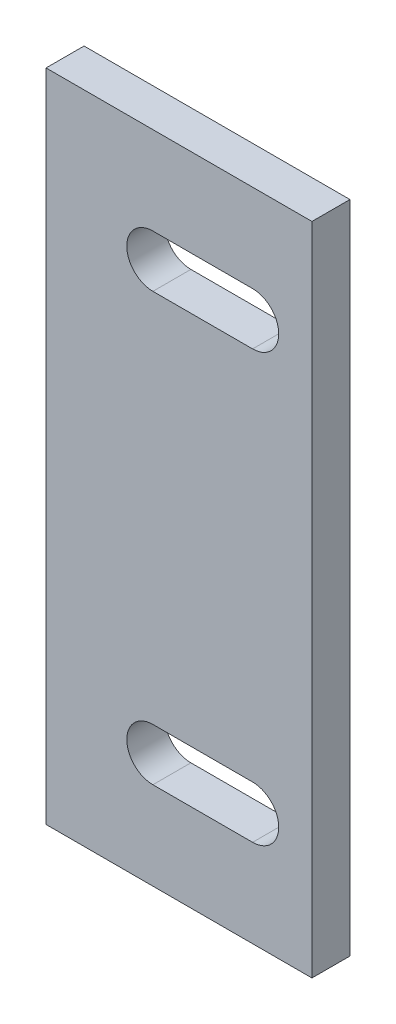
ISO-10303-21;
HEADER;
FILE_DESCRIPTION(('STEP AP214'),'2;1');
FILE_NAME('part.step','',(''),(''),'','','');
FILE_SCHEMA(('AUTOMOTIVE_DESIGN { 1 0 10303 214 1 1 1 1 }'));
ENDSEC;
DATA;
#1=APPLICATION_CONTEXT('core data for automotive mechanical design processes');
#2=APPLICATION_PROTOCOL_DEFINITION('international standard','automotive_design',2000,#1);
#3=PRODUCT_CONTEXT('',#1,'mechanical');
#4=PRODUCT('Part','Part','',(#3));
#5=PRODUCT_RELATED_PRODUCT_CATEGORY('part','',(#4));
#6=PRODUCT_DEFINITION_FORMATION('','',#4);
#7=PRODUCT_DEFINITION_CONTEXT('part definition',#1,'design');
#8=PRODUCT_DEFINITION('design','',#6,#7);
#9=PRODUCT_DEFINITION_SHAPE('','',#8);
#10=(LENGTH_UNIT() NAMED_UNIT(*) SI_UNIT(.MILLI.,.METRE.));
#11=(NAMED_UNIT(*) PLANE_ANGLE_UNIT() SI_UNIT($,.RADIAN.));
#12=(NAMED_UNIT(*) SI_UNIT($,.STERADIAN.) SOLID_ANGLE_UNIT());
#13=UNCERTAINTY_MEASURE_WITH_UNIT(LENGTH_MEASURE(1.E-05),#10,'distance_accuracy_value','');
#14=(GEOMETRIC_REPRESENTATION_CONTEXT(3) GLOBAL_UNCERTAINTY_ASSIGNED_CONTEXT((#13)) GLOBAL_UNIT_ASSIGNED_CONTEXT((#10,
#11,#12)) REPRESENTATION_CONTEXT('',''));
#15=CARTESIAN_POINT('',(0.,0.,0.));
#16=DIRECTION('',(0.,0.,1.));
#17=DIRECTION('',(1.,0.,0.));
#18=AXIS2_PLACEMENT_3D('',#15,#16,#17);
#19=CARTESIAN_POINT('',(0.,34.5,0.));
#20=DIRECTION('',(-1.,0.,0.));
#21=DIRECTION('',(0.,0.,1.));
#22=AXIS2_PLACEMENT_3D('',#19,#20,#21);
#23=PLANE('',#22);
#24=DIRECTION('',(0.,-1.,0.));
#25=VECTOR('',#24,1.);
#26=CARTESIAN_POINT('',(0.,34.5,4.));
#27=LINE('',#26,#25);
#28=CARTESIAN_POINT('',(0.,34.5,4.));
#29=VERTEX_POINT('',#28);
#30=CARTESIAN_POINT('',(0.,-34.5,4.));
#31=VERTEX_POINT('',#30);
#32=EDGE_CURVE('E195',#29,#31,#27,.T.);
#33=ORIENTED_EDGE('',*,*,#32,.F.);
#34=DIRECTION('',(0.,0.,1.));
#35=VECTOR('',#34,1.);
#36=CARTESIAN_POINT('',(0.,34.5,0.));
#37=LINE('',#36,#35);
#38=CARTESIAN_POINT('',(0.,34.5,0.));
#39=VERTEX_POINT('',#38);
#40=EDGE_CURVE('E11',#39,#29,#37,.T.);
#41=ORIENTED_EDGE('',*,*,#40,.F.);
#42=DIRECTION('',(0.,-1.,0.));
#43=VECTOR('',#42,1.);
#44=CARTESIAN_POINT('',(0.,34.5,0.));
#45=LINE('',#44,#43);
#46=CARTESIAN_POINT('',(0.,-34.5,0.));
#47=VERTEX_POINT('',#46);
#48=EDGE_CURVE('E200',#39,#47,#45,.T.);
#49=ORIENTED_EDGE('',*,*,#48,.T.);
#50=DIRECTION('',(0.,0.,1.));
#51=VECTOR('',#50,1.);
#52=CARTESIAN_POINT('',(0.,-34.5,0.));
#53=LINE('',#52,#51);
#54=EDGE_CURVE('E42',#47,#31,#53,.T.);
#55=ORIENTED_EDGE('',*,*,#54,.T.);
#56=EDGE_LOOP('',(#33,#41,#49,#55));
#57=FACE_BOUND('',#56,.T.);
#58=ADVANCED_FACE('F41',(#57),#23,.T.);
#59=CARTESIAN_POINT('',(28.,34.5,0.));
#60=DIRECTION('',(0.,1.,0.));
#61=DIRECTION('',(0.,0.,1.));
#62=AXIS2_PLACEMENT_3D('',#59,#60,#61);
#63=PLANE('',#62);
#64=DIRECTION('',(-1.,0.,0.));
#65=VECTOR('',#64,1.);
#66=CARTESIAN_POINT('',(28.,34.5,4.));
#67=LINE('',#66,#65);
#68=CARTESIAN_POINT('',(28.,34.5,4.));
#69=VERTEX_POINT('',#68);
#70=EDGE_CURVE('E202',#69,#29,#67,.T.);
#71=ORIENTED_EDGE('',*,*,#70,.F.);
#72=DIRECTION('',(0.,0.,1.));
#73=VECTOR('',#72,1.);
#74=CARTESIAN_POINT('',(28.,34.5,0.));
#75=LINE('',#74,#73);
#76=CARTESIAN_POINT('',(28.,34.5,0.));
#77=VERTEX_POINT('',#76);
#78=EDGE_CURVE('E47',#77,#69,#75,.T.);
#79=ORIENTED_EDGE('',*,*,#78,.F.);
#80=DIRECTION('',(-1.,0.,0.));
#81=VECTOR('',#80,1.);
#82=CARTESIAN_POINT('',(28.,34.5,0.));
#83=LINE('',#82,#81);
#84=EDGE_CURVE('E209',#77,#39,#83,.T.);
#85=ORIENTED_EDGE('',*,*,#84,.T.);
#86=ORIENTED_EDGE('',*,*,#40,.T.);
#87=EDGE_LOOP('',(#71,#79,#85,#86));
#88=FACE_BOUND('',#87,.T.);
#89=ADVANCED_FACE('F232',(#88),#63,.T.);
#90=CARTESIAN_POINT('',(28.,-34.5,0.));
#91=DIRECTION('',(1.,0.,0.));
#92=DIRECTION('',(0.,0.,-1.));
#93=AXIS2_PLACEMENT_3D('',#90,#91,#92);
#94=PLANE('',#93);
#95=DIRECTION('',(0.,1.,0.));
#96=VECTOR('',#95,1.);
#97=CARTESIAN_POINT('',(28.,-34.5,4.));
#98=LINE('',#97,#96);
#99=CARTESIAN_POINT('',(28.,-34.5,4.));
#100=VERTEX_POINT('',#99);
#101=EDGE_CURVE('E219',#100,#69,#98,.T.);
#102=ORIENTED_EDGE('',*,*,#101,.F.);
#103=DIRECTION('',(0.,0.,1.));
#104=VECTOR('',#103,1.);
#105=CARTESIAN_POINT('',(28.,-34.5,0.));
#106=LINE('',#105,#104);
#107=CARTESIAN_POINT('',(28.,-34.5,0.));
#108=VERTEX_POINT('',#107);
#109=EDGE_CURVE('E225',#108,#100,#106,.T.);
#110=ORIENTED_EDGE('',*,*,#109,.F.);
#111=DIRECTION('',(0.,1.,0.));
#112=VECTOR('',#111,1.);
#113=CARTESIAN_POINT('',(28.,-34.5,0.));
#114=LINE('',#113,#112);
#115=EDGE_CURVE('E207',#108,#77,#114,.T.);
#116=ORIENTED_EDGE('',*,*,#115,.T.);
#117=ORIENTED_EDGE('',*,*,#78,.T.);
#118=EDGE_LOOP('',(#102,#110,#116,#117));
#119=FACE_BOUND('',#118,.T.);
#120=ADVANCED_FACE('F239',(#119),#94,.T.);
#121=CARTESIAN_POINT('',(0.,-34.5,0.));
#122=DIRECTION('',(0.,-1.,0.));
#123=DIRECTION('',(0.,0.,-1.));
#124=AXIS2_PLACEMENT_3D('',#121,#122,#123);
#125=PLANE('',#124);
#126=DIRECTION('',(1.,0.,0.));
#127=VECTOR('',#126,1.);
#128=CARTESIAN_POINT('',(0.,-34.5,4.));
#129=LINE('',#128,#127);
#130=EDGE_CURVE('E211',#31,#100,#129,.T.);
#131=ORIENTED_EDGE('',*,*,#130,.F.);
#132=ORIENTED_EDGE('',*,*,#54,.F.);
#133=DIRECTION('',(1.,0.,0.));
#134=VECTOR('',#133,1.);
#135=CARTESIAN_POINT('',(0.,-34.5,0.));
#136=LINE('',#135,#134);
#137=EDGE_CURVE('E205',#47,#108,#136,.T.);
#138=ORIENTED_EDGE('',*,*,#137,.T.);
#139=ORIENTED_EDGE('',*,*,#109,.T.);
#140=EDGE_LOOP('',(#131,#132,#138,#139));
#141=FACE_BOUND('',#140,.T.);
#142=ADVANCED_FACE('F229',(#141),#125,.T.);
#143=CARTESIAN_POINT('',(0.,0.,0.));
#144=DIRECTION('',(0.,0.,1.));
#145=DIRECTION('',(1.,0.,0.));
#146=AXIS2_PLACEMENT_3D('',#143,#144,#145);
#147=PLANE('',#146);
#148=DIRECTION('',(-1.,0.,0.));
#149=VECTOR('',#148,1.);
#150=CARTESIAN_POINT('',(11.25,-19.75,0.));
#151=LINE('',#150,#149);
#152=CARTESIAN_POINT('',(21.75,-19.75,0.));
#153=VERTEX_POINT('',#152);
#154=CARTESIAN_POINT('',(11.25,-19.75,0.));
#155=VERTEX_POINT('',#154);
#156=EDGE_CURVE('E137',#153,#155,#151,.T.);
#157=ORIENTED_EDGE('',*,*,#156,.T.);
#158=CARTESIAN_POINT('',(11.25,-22.5,0.));
#159=DIRECTION('',(0.,0.,1.));
#160=DIRECTION('',(-1.,0.,0.));
#161=AXIS2_PLACEMENT_3D('',#158,#159,#160);
#162=CIRCLE('',#161,2.75);
#163=CARTESIAN_POINT('',(11.25,-25.25,0.));
#164=VERTEX_POINT('',#163);
#165=EDGE_CURVE('E134',#155,#164,#162,.T.);
#166=ORIENTED_EDGE('',*,*,#165,.T.);
#167=DIRECTION('',(1.,0.,0.));
#168=VECTOR('',#167,1.);
#169=CARTESIAN_POINT('',(21.75,-25.25,0.));
#170=LINE('',#169,#168);
#171=CARTESIAN_POINT('',(21.75,-25.25,0.));
#172=VERTEX_POINT('',#171);
#173=EDGE_CURVE('E142',#164,#172,#170,.T.);
#174=ORIENTED_EDGE('',*,*,#173,.T.);
#175=CARTESIAN_POINT('',(21.75,-22.5,0.));
#176=DIRECTION('',(0.,0.,1.));
#177=DIRECTION('',(-1.,0.,0.));
#178=AXIS2_PLACEMENT_3D('',#175,#176,#177);
#179=CIRCLE('',#178,2.75);
#180=EDGE_CURVE('E60',#172,#153,#179,.T.);
#181=ORIENTED_EDGE('',*,*,#180,.T.);
#182=EDGE_LOOP('',(#157,#166,#174,#181));
#183=FACE_BOUND('',#182,.T.);
#184=DIRECTION('',(-1.,0.,0.));
#185=VECTOR('',#184,1.);
#186=CARTESIAN_POINT('',(11.25,25.25,0.));
#187=LINE('',#186,#185);
#188=CARTESIAN_POINT('',(21.75,25.25,0.));
#189=VERTEX_POINT('',#188);
#190=CARTESIAN_POINT('',(11.25,25.25,0.));
#191=VERTEX_POINT('',#190);
#192=EDGE_CURVE('E180',#189,#191,#187,.T.);
#193=ORIENTED_EDGE('',*,*,#192,.T.);
#194=CARTESIAN_POINT('',(11.25,22.5,0.));
#195=DIRECTION('',(0.,0.,1.));
#196=DIRECTION('',(-1.,0.,0.));
#197=AXIS2_PLACEMENT_3D('',#194,#195,#196);
#198=CIRCLE('',#197,2.75);
#199=CARTESIAN_POINT('',(11.25,19.75,0.));
#200=VERTEX_POINT('',#199);
#201=EDGE_CURVE('E170',#191,#200,#198,.T.);
#202=ORIENTED_EDGE('',*,*,#201,.T.);
#203=DIRECTION('',(1.,0.,0.));
#204=VECTOR('',#203,1.);
#205=CARTESIAN_POINT('',(21.75,19.75,0.));
#206=LINE('',#205,#204);
#207=CARTESIAN_POINT('',(21.75,19.75,0.));
#208=VERTEX_POINT('',#207);
#209=EDGE_CURVE('E167',#200,#208,#206,.T.);
#210=ORIENTED_EDGE('',*,*,#209,.T.);
#211=CARTESIAN_POINT('',(21.75,22.5,0.));
#212=DIRECTION('',(0.,0.,1.));
#213=DIRECTION('',(-1.,0.,0.));
#214=AXIS2_PLACEMENT_3D('',#211,#212,#213);
#215=CIRCLE('',#214,2.75);
#216=EDGE_CURVE('E172',#208,#189,#215,.T.);
#217=ORIENTED_EDGE('',*,*,#216,.T.);
#218=EDGE_LOOP('',(#193,#202,#210,#217));
#219=FACE_BOUND('',#218,.T.);
#220=ORIENTED_EDGE('',*,*,#48,.F.);
#221=ORIENTED_EDGE('',*,*,#84,.F.);
#222=ORIENTED_EDGE('',*,*,#115,.F.);
#223=ORIENTED_EDGE('',*,*,#137,.F.);
#224=EDGE_LOOP('',(#220,#221,#222,#223));
#225=FACE_BOUND('',#224,.T.);
#226=ADVANCED_FACE('F143',(#183,#219,#225),#147,.F.);
#227=CARTESIAN_POINT('',(0.,0.,4.));
#228=DIRECTION('',(0.,0.,1.));
#229=DIRECTION('',(1.,0.,0.));
#230=AXIS2_PLACEMENT_3D('',#227,#228,#229);
#231=PLANE('',#230);
#232=CARTESIAN_POINT('',(11.25,-22.5,4.));
#233=DIRECTION('',(0.,0.,1.));
#234=DIRECTION('',(-1.,0.,0.));
#235=AXIS2_PLACEMENT_3D('',#232,#233,#234);
#236=CIRCLE('',#235,2.75);
#237=CARTESIAN_POINT('',(11.25,-19.75,4.));
#238=VERTEX_POINT('',#237);
#239=CARTESIAN_POINT('',(11.25,-25.25,4.));
#240=VERTEX_POINT('',#239);
#241=EDGE_CURVE('E63',#238,#240,#236,.T.);
#242=ORIENTED_EDGE('',*,*,#241,.F.);
#243=DIRECTION('',(-1.,0.,0.));
#244=VECTOR('',#243,1.);
#245=CARTESIAN_POINT('',(11.25,-19.75,4.));
#246=LINE('',#245,#244);
#247=CARTESIAN_POINT('',(21.75,-19.75,4.));
#248=VERTEX_POINT('',#247);
#249=EDGE_CURVE('E149',#248,#238,#246,.T.);
#250=ORIENTED_EDGE('',*,*,#249,.F.);
#251=CARTESIAN_POINT('',(21.75,-22.5,4.));
#252=DIRECTION('',(0.,0.,1.));
#253=DIRECTION('',(-1.,0.,0.));
#254=AXIS2_PLACEMENT_3D('',#251,#252,#253);
#255=CIRCLE('',#254,2.75);
#256=CARTESIAN_POINT('',(21.75,-25.25,4.));
#257=VERTEX_POINT('',#256);
#258=EDGE_CURVE('E153',#257,#248,#255,.T.);
#259=ORIENTED_EDGE('',*,*,#258,.F.);
#260=DIRECTION('',(1.,0.,0.));
#261=VECTOR('',#260,1.);
#262=CARTESIAN_POINT('',(21.75,-25.25,4.));
#263=LINE('',#262,#261);
#264=EDGE_CURVE('E160',#240,#257,#263,.T.);
#265=ORIENTED_EDGE('',*,*,#264,.F.);
#266=EDGE_LOOP('',(#242,#250,#259,#265));
#267=FACE_BOUND('',#266,.T.);
#268=CARTESIAN_POINT('',(11.25,22.5,4.));
#269=DIRECTION('',(0.,0.,1.));
#270=DIRECTION('',(-1.,0.,0.));
#271=AXIS2_PLACEMENT_3D('',#268,#269,#270);
#272=CIRCLE('',#271,2.75);
#273=CARTESIAN_POINT('',(11.25,25.25,4.));
#274=VERTEX_POINT('',#273);
#275=CARTESIAN_POINT('',(11.25,19.75,4.));
#276=VERTEX_POINT('',#275);
#277=EDGE_CURVE('E161',#274,#276,#272,.T.);
#278=ORIENTED_EDGE('',*,*,#277,.F.);
#279=DIRECTION('',(-1.,0.,0.));
#280=VECTOR('',#279,1.);
#281=CARTESIAN_POINT('',(11.25,25.25,4.));
#282=LINE('',#281,#280);
#283=CARTESIAN_POINT('',(21.75,25.25,4.));
#284=VERTEX_POINT('',#283);
#285=EDGE_CURVE('E171',#284,#274,#282,.T.);
#286=ORIENTED_EDGE('',*,*,#285,.F.);
#287=CARTESIAN_POINT('',(21.75,22.5,4.));
#288=DIRECTION('',(0.,0.,1.));
#289=DIRECTION('',(-1.,0.,0.));
#290=AXIS2_PLACEMENT_3D('',#287,#288,#289);
#291=CIRCLE('',#290,2.75);
#292=CARTESIAN_POINT('',(21.75,19.75,4.));
#293=VERTEX_POINT('',#292);
#294=EDGE_CURVE('E184',#293,#284,#291,.T.);
#295=ORIENTED_EDGE('',*,*,#294,.F.);
#296=DIRECTION('',(1.,0.,0.));
#297=VECTOR('',#296,1.);
#298=CARTESIAN_POINT('',(21.75,19.75,4.));
#299=LINE('',#298,#297);
#300=EDGE_CURVE('E185',#276,#293,#299,.T.);
#301=ORIENTED_EDGE('',*,*,#300,.F.);
#302=EDGE_LOOP('',(#278,#286,#295,#301));
#303=FACE_BOUND('',#302,.T.);
#304=ORIENTED_EDGE('',*,*,#32,.T.);
#305=ORIENTED_EDGE('',*,*,#130,.T.);
#306=ORIENTED_EDGE('',*,*,#101,.T.);
#307=ORIENTED_EDGE('',*,*,#70,.T.);
#308=EDGE_LOOP('',(#304,#305,#306,#307));
#309=FACE_BOUND('',#308,.T.);
#310=ADVANCED_FACE('F235',(#267,#303,#309),#231,.T.);
#311=CARTESIAN_POINT('',(11.25,22.5,0.));
#312=DIRECTION('',(0.,0.,1.));
#313=DIRECTION('',(1.,0.,0.));
#314=AXIS2_PLACEMENT_3D('',#311,#312,#313);
#315=CYLINDRICAL_SURFACE('',#314,2.75);
#316=ORIENTED_EDGE('',*,*,#277,.T.);
#317=DIRECTION('',(0.,0.,1.));
#318=VECTOR('',#317,1.);
#319=CARTESIAN_POINT('',(11.25,19.75,0.));
#320=LINE('',#319,#318);
#321=EDGE_CURVE('E179',#200,#276,#320,.T.);
#322=ORIENTED_EDGE('',*,*,#321,.F.);
#323=ORIENTED_EDGE('',*,*,#201,.F.);
#324=DIRECTION('',(0.,0.,1.));
#325=VECTOR('',#324,1.);
#326=CARTESIAN_POINT('',(11.25,25.25,0.));
#327=LINE('',#326,#325);
#328=EDGE_CURVE('E188',#191,#274,#327,.T.);
#329=ORIENTED_EDGE('',*,*,#328,.T.);
#330=EDGE_LOOP('',(#316,#322,#323,#329));
#331=FACE_BOUND('',#330,.T.);
#332=ADVANCED_FACE('F285',(#331),#315,.F.);
#333=CARTESIAN_POINT('',(11.25,25.25,0.));
#334=DIRECTION('',(0.,1.,0.));
#335=DIRECTION('',(0.,0.,1.));
#336=AXIS2_PLACEMENT_3D('',#333,#334,#335);
#337=PLANE('',#336);
#338=ORIENTED_EDGE('',*,*,#285,.T.);
#339=ORIENTED_EDGE('',*,*,#328,.F.);
#340=ORIENTED_EDGE('',*,*,#192,.F.);
#341=DIRECTION('',(0.,0.,1.));
#342=VECTOR('',#341,1.);
#343=CARTESIAN_POINT('',(21.75,25.25,0.));
#344=LINE('',#343,#342);
#345=EDGE_CURVE('E194',#189,#284,#344,.T.);
#346=ORIENTED_EDGE('',*,*,#345,.T.);
#347=EDGE_LOOP('',(#338,#339,#340,#346));
#348=FACE_BOUND('',#347,.T.);
#349=ADVANCED_FACE('F295',(#348),#337,.F.);
#350=CARTESIAN_POINT('',(21.75,22.5,0.));
#351=DIRECTION('',(0.,0.,1.));
#352=DIRECTION('',(1.,0.,0.));
#353=AXIS2_PLACEMENT_3D('',#350,#351,#352);
#354=CYLINDRICAL_SURFACE('',#353,2.75);
#355=ORIENTED_EDGE('',*,*,#294,.T.);
#356=ORIENTED_EDGE('',*,*,#345,.F.);
#357=ORIENTED_EDGE('',*,*,#216,.F.);
#358=DIRECTION('',(0.,0.,1.));
#359=VECTOR('',#358,1.);
#360=CARTESIAN_POINT('',(21.75,19.75,0.));
#361=LINE('',#360,#359);
#362=EDGE_CURVE('E193',#208,#293,#361,.T.);
#363=ORIENTED_EDGE('',*,*,#362,.T.);
#364=EDGE_LOOP('',(#355,#356,#357,#363));
#365=FACE_BOUND('',#364,.T.);
#366=ADVANCED_FACE('F302',(#365),#354,.F.);
#367=CARTESIAN_POINT('',(21.75,19.75,0.));
#368=DIRECTION('',(0.,-1.,0.));
#369=DIRECTION('',(1.,0.,0.));
#370=AXIS2_PLACEMENT_3D('',#367,#368,#369);
#371=PLANE('',#370);
#372=ORIENTED_EDGE('',*,*,#300,.T.);
#373=ORIENTED_EDGE('',*,*,#362,.F.);
#374=ORIENTED_EDGE('',*,*,#209,.F.);
#375=ORIENTED_EDGE('',*,*,#321,.T.);
#376=EDGE_LOOP('',(#372,#373,#374,#375));
#377=FACE_BOUND('',#376,.T.);
#378=ADVANCED_FACE('F313',(#377),#371,.F.);
#379=CARTESIAN_POINT('',(11.25,-22.5,0.));
#380=DIRECTION('',(0.,0.,1.));
#381=DIRECTION('',(1.,0.,0.));
#382=AXIS2_PLACEMENT_3D('',#379,#380,#381);
#383=CYLINDRICAL_SURFACE('',#382,2.75);
#384=ORIENTED_EDGE('',*,*,#241,.T.);
#385=DIRECTION('',(0.,0.,1.));
#386=VECTOR('',#385,1.);
#387=CARTESIAN_POINT('',(11.25,-25.25,0.));
#388=LINE('',#387,#386);
#389=EDGE_CURVE('E129',#164,#240,#388,.T.);
#390=ORIENTED_EDGE('',*,*,#389,.F.);
#391=ORIENTED_EDGE('',*,*,#165,.F.);
#392=DIRECTION('',(0.,0.,1.));
#393=VECTOR('',#392,1.);
#394=CARTESIAN_POINT('',(11.25,-19.75,0.));
#395=LINE('',#394,#393);
#396=EDGE_CURVE('E163',#155,#238,#395,.T.);
#397=ORIENTED_EDGE('',*,*,#396,.T.);
#398=EDGE_LOOP('',(#384,#390,#391,#397));
#399=FACE_BOUND('',#398,.T.);
#400=ADVANCED_FACE('F128',(#399),#383,.F.);
#401=CARTESIAN_POINT('',(11.25,-19.75,0.));
#402=DIRECTION('',(0.,1.,0.));
#403=DIRECTION('',(0.,0.,1.));
#404=AXIS2_PLACEMENT_3D('',#401,#402,#403);
#405=PLANE('',#404);
#406=ORIENTED_EDGE('',*,*,#249,.T.);
#407=ORIENTED_EDGE('',*,*,#396,.F.);
#408=ORIENTED_EDGE('',*,*,#156,.F.);
#409=DIRECTION('',(0.,0.,1.));
#410=VECTOR('',#409,1.);
#411=CARTESIAN_POINT('',(21.75,-19.75,0.));
#412=LINE('',#411,#410);
#413=EDGE_CURVE('E165',#153,#248,#412,.T.);
#414=ORIENTED_EDGE('',*,*,#413,.T.);
#415=EDGE_LOOP('',(#406,#407,#408,#414));
#416=FACE_BOUND('',#415,.T.);
#417=ADVANCED_FACE('F332',(#416),#405,.F.);
#418=CARTESIAN_POINT('',(21.75,-22.5,0.));
#419=DIRECTION('',(0.,0.,1.));
#420=DIRECTION('',(1.,0.,0.));
#421=AXIS2_PLACEMENT_3D('',#418,#419,#420);
#422=CYLINDRICAL_SURFACE('',#421,2.75);
#423=ORIENTED_EDGE('',*,*,#258,.T.);
#424=ORIENTED_EDGE('',*,*,#413,.F.);
#425=ORIENTED_EDGE('',*,*,#180,.F.);
#426=DIRECTION('',(0.,0.,1.));
#427=VECTOR('',#426,1.);
#428=CARTESIAN_POINT('',(21.75,-25.25,0.));
#429=LINE('',#428,#427);
#430=EDGE_CURVE('E140',#172,#257,#429,.T.);
#431=ORIENTED_EDGE('',*,*,#430,.T.);
#432=EDGE_LOOP('',(#423,#424,#425,#431));
#433=FACE_BOUND('',#432,.T.);
#434=ADVANCED_FACE('F345',(#433),#422,.F.);
#435=CARTESIAN_POINT('',(21.75,-25.25,0.));
#436=DIRECTION('',(0.,-1.,0.));
#437=DIRECTION('',(0.,0.,-1.));
#438=AXIS2_PLACEMENT_3D('',#435,#436,#437);
#439=PLANE('',#438);
#440=ORIENTED_EDGE('',*,*,#264,.T.);
#441=ORIENTED_EDGE('',*,*,#430,.F.);
#442=ORIENTED_EDGE('',*,*,#173,.F.);
#443=ORIENTED_EDGE('',*,*,#389,.T.);
#444=EDGE_LOOP('',(#440,#441,#442,#443));
#445=FACE_BOUND('',#444,.T.);
#446=ADVANCED_FACE('F145',(#445),#439,.F.);
#447=CLOSED_SHELL('',(#58,#89,#120,#142,#226,#310,#332,#349,#366,#378,#400,#417,#434,#446));
#448=MANIFOLD_SOLID_BREP('B2',#447);
#449=ADVANCED_BREP_SHAPE_REPRESENTATION('',(#18,#448),#14);
#450=SHAPE_DEFINITION_REPRESENTATION(#9,#449);
ENDSEC;
END-ISO-10303-21;
